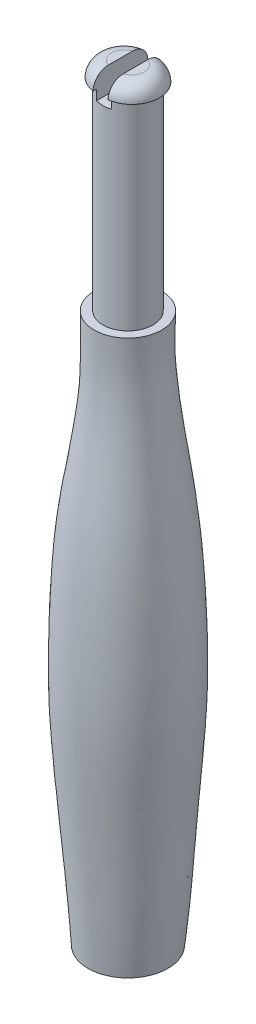
ISO-10303-21;
HEADER;
FILE_DESCRIPTION(('STEP AP214'),'2;1');
FILE_NAME('part.step','',(''),(''),'','','');
FILE_SCHEMA(('AUTOMOTIVE_DESIGN { 1 0 10303 214 1 1 1 1 }'));
ENDSEC;
DATA;
#1=APPLICATION_CONTEXT('core data for automotive mechanical design processes');
#2=APPLICATION_PROTOCOL_DEFINITION('international standard','automotive_design',2000,#1);
#3=PRODUCT_CONTEXT('',#1,'mechanical');
#4=PRODUCT('Part','Part','',(#3));
#5=PRODUCT_RELATED_PRODUCT_CATEGORY('part','',(#4));
#6=PRODUCT_DEFINITION_FORMATION('','',#4);
#7=PRODUCT_DEFINITION_CONTEXT('part definition',#1,'design');
#8=PRODUCT_DEFINITION('design','',#6,#7);
#9=PRODUCT_DEFINITION_SHAPE('','',#8);
#10=(LENGTH_UNIT() NAMED_UNIT(*) SI_UNIT(.MILLI.,.METRE.));
#11=(NAMED_UNIT(*) PLANE_ANGLE_UNIT() SI_UNIT($,.RADIAN.));
#12=(NAMED_UNIT(*) SI_UNIT($,.STERADIAN.) SOLID_ANGLE_UNIT());
#13=UNCERTAINTY_MEASURE_WITH_UNIT(LENGTH_MEASURE(1.E-05),#10,'distance_accuracy_value','');
#14=(GEOMETRIC_REPRESENTATION_CONTEXT(3) GLOBAL_UNCERTAINTY_ASSIGNED_CONTEXT((#13)) GLOBAL_UNIT_ASSIGNED_CONTEXT((#10,
#11,#12)) REPRESENTATION_CONTEXT('',''));
#15=CARTESIAN_POINT('',(0.,0.,0.));
#16=DIRECTION('',(0.,0.,1.));
#17=DIRECTION('',(1.,0.,0.));
#18=AXIS2_PLACEMENT_3D('',#15,#16,#17);
#19=CARTESIAN_POINT('',(-1.49848932062445E-13,150.,1.49848932062445E-13));
#20=DIRECTION('',(0.,-1.,0.));
#21=DIRECTION('',(0.,0.,-1.));
#22=AXIS2_PLACEMENT_3D('',#19,#20,#21);
#23=CYLINDRICAL_SURFACE('',#22,5.);
#24=DIRECTION('',(0.,1.,0.));
#25=VECTOR('',#24,1.);
#26=CARTESIAN_POINT('',(1.49999999999985,148.,-4.76969600708458));
#27=LINE('',#26,#25);
#28=CARTESIAN_POINT('',(1.49999999999985,148.,-4.76969600708458));
#29=VERTEX_POINT('',#28);
#30=CARTESIAN_POINT('',(1.49999999999985,150.,-4.76969600708458));
#31=VERTEX_POINT('',#30);
#32=EDGE_CURVE('E215',#29,#31,#27,.T.);
#33=ORIENTED_EDGE('',*,*,#32,.T.);
#34=CARTESIAN_POINT('',(-1.49848932062445E-13,150.,1.49848932062445E-13));
#35=DIRECTION('',(0.,-1.,0.));
#36=DIRECTION('',(0.,0.,-1.));
#37=AXIS2_PLACEMENT_3D('',#34,#35,#36);
#38=CIRCLE('',#37,5.);
#39=CARTESIAN_POINT('',(1.49999999999985,150.,4.76969600708488));
#40=VERTEX_POINT('',#39);
#41=EDGE_CURVE('E230',#31,#40,#38,.T.);
#42=ORIENTED_EDGE('',*,*,#41,.T.);
#43=DIRECTION('',(0.,1.,0.));
#44=VECTOR('',#43,1.);
#45=CARTESIAN_POINT('',(1.49999999999985,148.,4.76969600708488));
#46=LINE('',#45,#44);
#47=CARTESIAN_POINT('',(1.49999999999985,148.,4.76969600708488));
#48=VERTEX_POINT('',#47);
#49=EDGE_CURVE('E220',#48,#40,#46,.T.);
#50=ORIENTED_EDGE('',*,*,#49,.F.);
#51=CARTESIAN_POINT('',(-1.47850946301613E-13,148.,1.47850946301613E-13));
#52=DIRECTION('',(0.,1.,0.));
#53=DIRECTION('',(0.,0.,1.));
#54=AXIS2_PLACEMENT_3D('',#51,#52,#53);
#55=CIRCLE('',#54,5.);
#56=CARTESIAN_POINT('',(-1.50000000000015,148.,4.76969600708488));
#57=VERTEX_POINT('',#56);
#58=EDGE_CURVE('E207',#57,#48,#55,.T.);
#59=ORIENTED_EDGE('',*,*,#58,.F.);
#60=DIRECTION('',(0.,1.,0.));
#61=VECTOR('',#60,1.);
#62=CARTESIAN_POINT('',(-1.50000000000015,148.,4.76969600708488));
#63=LINE('',#62,#61);
#64=CARTESIAN_POINT('',(-1.50000000000015,150.,4.76969600708488));
#65=VERTEX_POINT('',#64);
#66=EDGE_CURVE('E224',#57,#65,#63,.T.);
#67=ORIENTED_EDGE('',*,*,#66,.T.);
#68=CARTESIAN_POINT('',(-1.50000000000015,150.,-4.76969600708458));
#69=VERTEX_POINT('',#68);
#70=EDGE_CURVE('E175',#65,#69,#38,.T.);
#71=ORIENTED_EDGE('',*,*,#70,.T.);
#72=DIRECTION('',(0.,1.,0.));
#73=VECTOR('',#72,1.);
#74=CARTESIAN_POINT('',(-1.50000000000015,148.,-4.76969600708458));
#75=LINE('',#74,#73);
#76=CARTESIAN_POINT('',(-1.50000000000015,148.,-4.76969600708458));
#77=VERTEX_POINT('',#76);
#78=EDGE_CURVE('E214',#77,#69,#75,.T.);
#79=ORIENTED_EDGE('',*,*,#78,.F.);
#80=CARTESIAN_POINT('',(-1.47850946301613E-13,148.,1.47850946301613E-13));
#81=DIRECTION('',(0.,1.,0.));
#82=DIRECTION('',(0.,0.,1.));
#83=AXIS2_PLACEMENT_3D('',#80,#81,#82);
#84=CIRCLE('',#83,5.);
#85=EDGE_CURVE('E191',#29,#77,#84,.T.);
#86=ORIENTED_EDGE('',*,*,#85,.F.);
#87=EDGE_LOOP('',(#33,#42,#50,#59,#67,#71,#79,#86));
#88=FACE_BOUND('',#87,.T.);
#89=CARTESIAN_POINT('',(-1.09889216845793E-13,110.,1.09889216845793E-13));
#90=DIRECTION('',(0.,-1.,0.));
#91=DIRECTION('',(0.,0.,-1.));
#92=AXIS2_PLACEMENT_3D('',#89,#90,#91);
#93=CIRCLE('',#92,5.);
#94=CARTESIAN_POINT('',(-1.09889216845793E-13,110.,-4.99999999999989));
#95=VERTEX_POINT('',#94);
#96=EDGE_CURVE('E219',#95,#95,#93,.T.);
#97=ORIENTED_EDGE('',*,*,#96,.F.);
#98=EDGE_LOOP('',(#97));
#99=FACE_BOUND('',#98,.T.);
#100=ADVANCED_FACE('F81',(#88,#99),#23,.T.);
#101=CARTESIAN_POINT('',(-1.09889216845793E-13,110.,1.09889216845793E-13));
#102=DIRECTION('',(0.,-1.,0.));
#103=DIRECTION('',(0.,0.,-1.));
#104=AXIS2_PLACEMENT_3D('',#101,#102,#103);
#105=PLANE('',#104);
#106=ORIENTED_EDGE('',*,*,#96,.T.);
#107=EDGE_LOOP('',(#106));
#108=FACE_BOUND('',#107,.T.);
#109=ADVANCED_FACE('F261',(#108),#105,.T.);
#110=CARTESIAN_POINT('',(1.49999999999985,148.,4.76969600708488));
#111=DIRECTION('',(1.,0.,0.));
#112=DIRECTION('',(0.,1.,0.));
#113=AXIS2_PLACEMENT_3D('',#110,#111,#112);
#114=PLANE('',#113);
#115=DIRECTION('',(0.,0.,1.));
#116=VECTOR('',#115,1.);
#117=CARTESIAN_POINT('',(1.49999999999985,153.,-5.47317321121836));
#118=LINE('',#117,#116);
#119=CARTESIAN_POINT('',(1.49999999999985,153.,-2.41523484882925));
#120=VERTEX_POINT('',#119);
#121=CARTESIAN_POINT('',(1.49999999999985,153.,2.41523484882956));
#122=VERTEX_POINT('',#121);
#123=EDGE_CURVE('E187',#120,#122,#118,.T.);
#124=ORIENTED_EDGE('',*,*,#123,.F.);
#125=CARTESIAN_POINT('',(1.49999999999985,153.,-2.41523484882925));
#126=CARTESIAN_POINT('',(1.49999999999985,153.000017058611,-2.50479520211446));
#127=CARTESIAN_POINT('',(1.49999999999985,152.996316458633,-2.59436427616199));
#128=CARTESIAN_POINT('',(1.49999999999985,152.981409998157,-2.77289406426873));
#129=CARTESIAN_POINT('',(1.49999999999985,152.970202467802,-2.86185463852326));
#130=CARTESIAN_POINT('',(1.49999999999985,152.940207753691,-3.03852699684103));
#131=CARTESIAN_POINT('',(1.49999999999985,152.921418356523,-3.12623840848187));
#132=CARTESIAN_POINT('',(1.49999999999985,152.876333018237,-3.29967501447033));
#133=CARTESIAN_POINT('',(1.49999999999985,152.850037870796,-3.38540041778788));
#134=CARTESIAN_POINT('',(1.49999999999985,152.760641529783,-3.63691735873574));
#135=CARTESIAN_POINT('',(1.49999999999985,152.686696072893,-3.79901163951167));
#136=CARTESIAN_POINT('',(1.49999999999985,152.511726114415,-4.10761259592768));
#137=CARTESIAN_POINT('',(1.49999999999985,152.410721819697,-4.25413078981842));
#138=CARTESIAN_POINT('',(1.49999999999985,152.18865125786,-4.52217640491635));
#139=CARTESIAN_POINT('',(1.49999999999985,152.068448736301,-4.64441918345205));
#140=CARTESIAN_POINT('',(1.49999999999985,151.808933187061,-4.86668575947977));
#141=CARTESIAN_POINT('',(1.49999999999985,151.669615011733,-4.96670355294529));
#142=CARTESIAN_POINT('',(1.49999999999985,151.377927438106,-5.14029074069879));
#143=CARTESIAN_POINT('',(1.49999999999985,151.225757576704,-5.21419606669464));
#144=CARTESIAN_POINT('',(1.49999999999985,150.911175526208,-5.33519013866772));
#145=CARTESIAN_POINT('',(1.49999999999985,150.748772227355,-5.38230181422073));
#146=CARTESIAN_POINT('',(1.49999999999985,150.487574636789,-5.43458106794303));
#147=CARTESIAN_POINT('',(1.49999999999985,150.390548319795,-5.44904905334437));
#148=CARTESIAN_POINT('',(1.49999999999985,150.195695970415,-5.46834023153826));
#149=CARTESIAN_POINT('',(1.49999999999985,150.097871437744,-5.47317857444688));
#150=CARTESIAN_POINT('',(1.49999999999985,150.,-5.47317321121837));
#151=B_SPLINE_CURVE_WITH_KNOTS('',3,(#125,#126,#127,#128,#129,#130,#131,#132,#133,#134,#135,
#136,#137,#138,#139,#140,#141,#142,#143,#144,#145,#146,#147,#148,#149,#150),.UNSPECIFIED.,.F.,
.F.,(4,2,2,2,2,2,2,2,2,2,2,2,4),(0.,0.268615320819069,0.537290412834672,0.806043997330498,
1.07476917365609,1.60632891703442,2.13749280596515,2.64932885674469,3.16130301116006,
3.66642786126774,4.17111978064965,4.46498494408795,4.75838740895957),.UNSPECIFIED.);
#152=CARTESIAN_POINT('',(1.49999999999985,150.,-5.47317321121837));
#153=VERTEX_POINT('',#152);
#154=EDGE_CURVE('E248',#120,#153,#151,.T.);
#155=ORIENTED_EDGE('',*,*,#154,.T.);
#156=DIRECTION('',(0.,0.,1.));
#157=VECTOR('',#156,1.);
#158=CARTESIAN_POINT('',(1.49999999999985,150.,-5.47317321121837));
#159=LINE('',#158,#157);
#160=EDGE_CURVE('E192',#153,#31,#159,.T.);
#161=ORIENTED_EDGE('',*,*,#160,.T.);
#162=ORIENTED_EDGE('',*,*,#32,.F.);
#163=DIRECTION('',(0.,0.,-1.));
#164=VECTOR('',#163,1.);
#165=CARTESIAN_POINT('',(1.49999999999985,148.,4.76969600708488));
#166=LINE('',#165,#164);
#167=EDGE_CURVE('E210',#48,#29,#166,.T.);
#168=ORIENTED_EDGE('',*,*,#167,.F.);
#169=ORIENTED_EDGE('',*,*,#49,.T.);
#170=CARTESIAN_POINT('',(1.49999999999985,150.,5.47317321121867));
#171=VERTEX_POINT('',#170);
#172=EDGE_CURVE('E197',#40,#171,#159,.T.);
#173=ORIENTED_EDGE('',*,*,#172,.T.);
#174=CARTESIAN_POINT('',(1.49999999999985,150.,5.47317321121867));
#175=CARTESIAN_POINT('',(1.49999999999985,150.083761351196,5.47318147565272));
#176=CARTESIAN_POINT('',(1.49999999999985,150.167518788211,5.46963501454631));
#177=CARTESIAN_POINT('',(1.49999999999985,150.33443232537,5.45549654399866));
#178=CARTESIAN_POINT('',(1.49999999999985,150.417588459091,5.44490493106639));
#179=CARTESIAN_POINT('',(1.49999999999985,150.582638764506,5.41675312459688));
#180=CARTESIAN_POINT('',(1.49999999999985,150.664534036465,5.39919941191866));
#181=CARTESIAN_POINT('',(1.49999999999985,150.826534297394,5.35726893413452));
#182=CARTESIAN_POINT('',(1.49999999999985,150.906639305679,5.33289224267447));
#183=CARTESIAN_POINT('',(1.49999999999985,151.143489984933,5.24973311676771));
#184=CARTESIAN_POINT('',(1.49999999999985,151.296845767303,5.18090885606034));
#185=CARTESIAN_POINT('',(1.49999999999985,151.589754696767,5.01858428831538));
#186=CARTESIAN_POINT('',(1.49999999999985,151.729309277256,4.92508654757825));
#187=CARTESIAN_POINT('',(1.49999999999985,151.991144644232,4.71586110385369));
#188=CARTESIAN_POINT('',(1.49999999999985,152.113387194987,4.60008548683813));
#189=CARTESIAN_POINT('',(1.49999999999985,152.336862413262,4.34978037553934));
#190=CARTESIAN_POINT('',(1.49999999999985,152.438093831183,4.2152497666333));
#191=CARTESIAN_POINT('',(1.49999999999985,152.617537853716,3.93025847617379));
#192=CARTESIAN_POINT('',(1.49999999999985,152.695575773745,3.77968796059336));
#193=CARTESIAN_POINT('',(1.49999999999985,152.825718711644,3.46771575454883));
#194=CARTESIAN_POINT('',(1.49999999999985,152.877825458911,3.30631478720243));
#195=CARTESIAN_POINT('',(1.49999999999985,152.944445726797,3.02278146434177));
#196=CARTESIAN_POINT('',(1.49999999999985,152.965365552378,2.90210505085879));
#197=CARTESIAN_POINT('',(1.49999999999985,152.993153863968,2.65936476095003));
#198=CARTESIAN_POINT('',(1.49999999999985,153.000048097548,2.53730384129184));
#199=CARTESIAN_POINT('',(1.49999999999985,153.,2.41523484882956));
#200=B_SPLINE_CURVE_WITH_KNOTS('',3,(#174,#175,#176,#177,#178,#179,#180,#181,#182,#183,#184,
#185,#186,#187,#188,#189,#190,#191,#192,#193,#194,#195,#196,#197,#198,#199),.UNSPECIFIED.,.F.,
.F.,(4,2,2,2,2,2,2,2,2,2,2,2,4),(0.,0.251201971966918,0.502389807203627,0.753344364185471,
1.00429621251878,1.50597612970048,2.0076038874659,2.51032282726639,3.01307165676584,
3.51951625490598,4.0259270727962,4.39257664856152,4.75855253540268),.UNSPECIFIED.);
#201=EDGE_CURVE('E240',#171,#122,#200,.T.);
#202=ORIENTED_EDGE('',*,*,#201,.T.);
#203=EDGE_LOOP('',(#124,#155,#161,#162,#168,#169,#173,#202));
#204=FACE_BOUND('',#203,.T.);
#205=ADVANCED_FACE('F257',(#204),#114,.F.);
#206=CARTESIAN_POINT('',(-1.50000000000015,148.,4.76969600708488));
#207=DIRECTION('',(-1.,0.,0.));
#208=DIRECTION('',(0.,-1.,0.));
#209=AXIS2_PLACEMENT_3D('',#206,#207,#208);
#210=PLANE('',#209);
#211=DIRECTION('',(0.,0.,-1.));
#212=VECTOR('',#211,1.);
#213=CARTESIAN_POINT('',(-1.50000000000015,153.,-5.47317321121836));
#214=LINE('',#213,#212);
#215=CARTESIAN_POINT('',(-1.50000000000015,153.,2.41523484882956));
#216=VERTEX_POINT('',#215);
#217=CARTESIAN_POINT('',(-1.50000000000015,153.,-2.41523484882925));
#218=VERTEX_POINT('',#217);
#219=EDGE_CURVE('E169',#216,#218,#214,.T.);
#220=ORIENTED_EDGE('',*,*,#219,.F.);
#221=CARTESIAN_POINT('',(-1.50000000000015,153.,2.41523484882956));
#222=CARTESIAN_POINT('',(-1.50000000000015,153.000017058611,2.50479520211476));
#223=CARTESIAN_POINT('',(-1.50000000000015,152.996316458633,2.59436427616229));
#224=CARTESIAN_POINT('',(-1.50000000000015,152.981409998157,2.77289406426903));
#225=CARTESIAN_POINT('',(-1.50000000000015,152.970202467802,2.86185463852356));
#226=CARTESIAN_POINT('',(-1.50000000000015,152.940207753691,3.03852699684133));
#227=CARTESIAN_POINT('',(-1.50000000000015,152.921418356523,3.12623840848217));
#228=CARTESIAN_POINT('',(-1.50000000000015,152.876333018237,3.29967501447063));
#229=CARTESIAN_POINT('',(-1.50000000000015,152.850037870796,3.38540041778817));
#230=CARTESIAN_POINT('',(-1.50000000000015,152.760641529783,3.63691735873604));
#231=CARTESIAN_POINT('',(-1.50000000000015,152.686696072893,3.79901163951197));
#232=CARTESIAN_POINT('',(-1.50000000000015,152.511726114415,4.10761259592798));
#233=CARTESIAN_POINT('',(-1.50000000000015,152.410721819697,4.25413078981872));
#234=CARTESIAN_POINT('',(-1.50000000000015,152.18865125786,4.52217640491665));
#235=CARTESIAN_POINT('',(-1.50000000000015,152.068448736301,4.64441918345235));
#236=CARTESIAN_POINT('',(-1.50000000000015,151.808933187061,4.86668575948007));
#237=CARTESIAN_POINT('',(-1.50000000000015,151.669615011733,4.96670355294558));
#238=CARTESIAN_POINT('',(-1.50000000000015,151.377927438106,5.14029074069909));
#239=CARTESIAN_POINT('',(-1.50000000000015,151.225757576704,5.21419606669494));
#240=CARTESIAN_POINT('',(-1.50000000000015,150.911175526208,5.33519013866802));
#241=CARTESIAN_POINT('',(-1.50000000000015,150.748772227355,5.38230181422103));
#242=CARTESIAN_POINT('',(-1.50000000000015,150.487574636789,5.43458106794333));
#243=CARTESIAN_POINT('',(-1.50000000000015,150.390548319795,5.44904905334467));
#244=CARTESIAN_POINT('',(-1.50000000000015,150.195695970415,5.46834023153856));
#245=CARTESIAN_POINT('',(-1.50000000000015,150.097871437744,5.47317857444718));
#246=CARTESIAN_POINT('',(-1.50000000000015,150.,5.47317321121867));
#247=B_SPLINE_CURVE_WITH_KNOTS('',3,(#221,#222,#223,#224,#225,#226,#227,#228,#229,#230,#231,
#232,#233,#234,#235,#236,#237,#238,#239,#240,#241,#242,#243,#244,#245,#246),.UNSPECIFIED.,.F.,
.F.,(4,2,2,2,2,2,2,2,2,2,2,2,4),(0.,0.268615320819065,0.537290412834666,0.80604399733049,
1.07476917365609,1.60632891703442,2.13749280596515,2.64932885674468,3.16130301116005,
3.66642786126773,4.17111978064964,4.46498494408794,4.75838740895956),.UNSPECIFIED.);
#248=CARTESIAN_POINT('',(-1.50000000000015,150.,5.47317321121867));
#249=VERTEX_POINT('',#248);
#250=EDGE_CURVE('E14',#216,#249,#247,.T.);
#251=ORIENTED_EDGE('',*,*,#250,.T.);
#252=DIRECTION('',(0.,0.,-1.));
#253=VECTOR('',#252,1.);
#254=CARTESIAN_POINT('',(-1.50000000000015,150.,-5.47317321121837));
#255=LINE('',#254,#253);
#256=EDGE_CURVE('E167',#249,#65,#255,.T.);
#257=ORIENTED_EDGE('',*,*,#256,.T.);
#258=ORIENTED_EDGE('',*,*,#66,.F.);
#259=DIRECTION('',(0.,0.,1.));
#260=VECTOR('',#259,1.);
#261=CARTESIAN_POINT('',(-1.50000000000015,148.,4.76969600708488));
#262=LINE('',#261,#260);
#263=EDGE_CURVE('E203',#77,#57,#262,.T.);
#264=ORIENTED_EDGE('',*,*,#263,.F.);
#265=ORIENTED_EDGE('',*,*,#78,.T.);
#266=CARTESIAN_POINT('',(-1.50000000000015,150.,-5.47317321121837));
#267=VERTEX_POINT('',#266);
#268=EDGE_CURVE('E178',#69,#267,#255,.T.);
#269=ORIENTED_EDGE('',*,*,#268,.T.);
#270=CARTESIAN_POINT('',(-1.50000000000015,150.,-5.47317321121837));
#271=CARTESIAN_POINT('',(-1.50000000000015,150.083761351196,-5.47318147565242));
#272=CARTESIAN_POINT('',(-1.50000000000015,150.167518788211,-5.46963501454601));
#273=CARTESIAN_POINT('',(-1.50000000000015,150.33443232537,-5.45549654399836));
#274=CARTESIAN_POINT('',(-1.50000000000015,150.417588459091,-5.44490493106609));
#275=CARTESIAN_POINT('',(-1.50000000000015,150.582638764506,-5.41675312459658));
#276=CARTESIAN_POINT('',(-1.50000000000015,150.664534036465,-5.39919941191836));
#277=CARTESIAN_POINT('',(-1.50000000000015,150.826534297394,-5.35726893413422));
#278=CARTESIAN_POINT('',(-1.50000000000015,150.906639305679,-5.33289224267417));
#279=CARTESIAN_POINT('',(-1.50000000000015,151.143489984933,-5.24973311676741));
#280=CARTESIAN_POINT('',(-1.50000000000015,151.296845767303,-5.18090885606004));
#281=CARTESIAN_POINT('',(-1.50000000000015,151.589754696767,-5.01858428831508));
#282=CARTESIAN_POINT('',(-1.50000000000015,151.729309277256,-4.92508654757796));
#283=CARTESIAN_POINT('',(-1.50000000000015,151.991144644232,-4.71586110385339));
#284=CARTESIAN_POINT('',(-1.50000000000015,152.113387194987,-4.60008548683783));
#285=CARTESIAN_POINT('',(-1.50000000000015,152.336862413262,-4.34978037553904));
#286=CARTESIAN_POINT('',(-1.50000000000015,152.438093831183,-4.215249766633));
#287=CARTESIAN_POINT('',(-1.50000000000015,152.617537853716,-3.93025847617349));
#288=CARTESIAN_POINT('',(-1.50000000000015,152.695575773745,-3.77968796059307));
#289=CARTESIAN_POINT('',(-1.50000000000015,152.825718711644,-3.46771575454854));
#290=CARTESIAN_POINT('',(-1.50000000000015,152.877825458911,-3.30631478720214));
#291=CARTESIAN_POINT('',(-1.50000000000015,152.944445726797,-3.02278146434147));
#292=CARTESIAN_POINT('',(-1.50000000000015,152.965365552378,-2.90210505085849));
#293=CARTESIAN_POINT('',(-1.50000000000015,152.993153863968,-2.65936476094973));
#294=CARTESIAN_POINT('',(-1.50000000000015,153.000048097548,-2.53730384129153));
#295=CARTESIAN_POINT('',(-1.50000000000015,153.,-2.41523484882925));
#296=B_SPLINE_CURVE_WITH_KNOTS('',3,(#270,#271,#272,#273,#274,#275,#276,#277,#278,#279,#280,
#281,#282,#283,#284,#285,#286,#287,#288,#289,#290,#291,#292,#293,#294,#295),.UNSPECIFIED.,.F.,
.F.,(4,2,2,2,2,2,2,2,2,2,2,2,4),(0.,0.251201971966918,0.502389807203627,0.753344364185471,
1.00429621251878,1.50597612970048,2.0076038874659,2.51032282726639,3.01307165676584,
3.51951625490598,4.0259270727962,4.39257664856152,4.7585525354027),.UNSPECIFIED.);
#297=EDGE_CURVE('E96',#267,#218,#296,.T.);
#298=ORIENTED_EDGE('',*,*,#297,.T.);
#299=EDGE_LOOP('',(#220,#251,#257,#258,#264,#265,#269,#298));
#300=FACE_BOUND('',#299,.T.);
#301=ADVANCED_FACE('F166',(#300),#210,.F.);
#302=CARTESIAN_POINT('',(-1.47850946301613E-13,148.,1.47850946301613E-13));
#303=DIRECTION('',(0.,1.,0.));
#304=DIRECTION('',(0.,0.,1.));
#305=AXIS2_PLACEMENT_3D('',#302,#303,#304);
#306=PLANE('',#305);
#307=ORIENTED_EDGE('',*,*,#85,.T.);
#308=ORIENTED_EDGE('',*,*,#263,.T.);
#309=ORIENTED_EDGE('',*,*,#58,.T.);
#310=ORIENTED_EDGE('',*,*,#167,.T.);
#311=EDGE_LOOP('',(#307,#308,#309,#310));
#312=FACE_BOUND('',#311,.T.);
#313=ADVANCED_FACE('F263',(#312),#306,.T.);
#314=CARTESIAN_POINT('',(0.779622395833181,153.,1.52845910703694E-13));
#315=DIRECTION('',(0.,-1.,0.));
#316=DIRECTION('',(0.,0.,-1.));
#317=AXIS2_PLACEMENT_3D('',#314,#315,#316);
#318=PLANE('',#317);
#319=ORIENTED_EDGE('',*,*,#123,.T.);
#320=CARTESIAN_POINT('',(0.779622395833181,153.,1.52845910703694E-13));
#321=DIRECTION('',(0.,-1.,0.));
#322=DIRECTION('',(0.,0.,-1.));
#323=AXIS2_PLACEMENT_3D('',#320,#321,#322);
#324=CIRCLE('',#323,2.52037760416667);
#325=EDGE_CURVE('E234',#122,#120,#324,.F.);
#326=ORIENTED_EDGE('',*,*,#325,.T.);
#327=EDGE_LOOP('',(#319,#326));
#328=FACE_BOUND('',#327,.T.);
#329=ADVANCED_FACE('F288',(#328),#318,.F.);
#330=CARTESIAN_POINT('',(0.779622395833184,150.,1.49848932062445E-13));
#331=DIRECTION('',(0.,-1.,0.));
#332=DIRECTION('',(0.,0.,-1.));
#333=AXIS2_PLACEMENT_3D('',#330,#331,#332);
#334=PLANE('',#333);
#335=ORIENTED_EDGE('',*,*,#172,.F.);
#336=ORIENTED_EDGE('',*,*,#41,.F.);
#337=ORIENTED_EDGE('',*,*,#160,.F.);
#338=CARTESIAN_POINT('',(0.779622395833184,150.,1.49848932062445E-13));
#339=DIRECTION('',(0.,1.,0.));
#340=DIRECTION('',(0.,0.,-1.));
#341=AXIS2_PLACEMENT_3D('',#338,#339,#340);
#342=CIRCLE('',#341,5.52037760416667);
#343=EDGE_CURVE('E193',#171,#153,#342,.T.);
#344=ORIENTED_EDGE('',*,*,#343,.F.);
#345=EDGE_LOOP('',(#335,#336,#337,#344));
#346=FACE_BOUND('',#345,.T.);
#347=ADVANCED_FACE('F285',(#346),#334,.T.);
#348=CARTESIAN_POINT('',(-0.779622395833487,153.,1.52845910703694E-13));
#349=DIRECTION('',(0.,1.,0.));
#350=DIRECTION('',(0.,0.,1.));
#351=AXIS2_PLACEMENT_3D('',#348,#349,#350);
#352=PLANE('',#351);
#353=ORIENTED_EDGE('',*,*,#219,.T.);
#354=CARTESIAN_POINT('',(-0.779622395833487,153.,1.52845910703694E-13));
#355=DIRECTION('',(0.,1.,0.));
#356=DIRECTION('',(0.,0.,1.));
#357=AXIS2_PLACEMENT_3D('',#354,#355,#356);
#358=CIRCLE('',#357,2.52037760416667);
#359=EDGE_CURVE('E274',#218,#216,#358,.T.);
#360=ORIENTED_EDGE('',*,*,#359,.T.);
#361=EDGE_LOOP('',(#353,#360));
#362=FACE_BOUND('',#361,.T.);
#363=ADVANCED_FACE('F295',(#362),#352,.T.);
#364=CARTESIAN_POINT('',(-0.779622395833484,150.,1.49848932062445E-13));
#365=DIRECTION('',(0.,1.,0.));
#366=DIRECTION('',(0.,0.,1.));
#367=AXIS2_PLACEMENT_3D('',#364,#365,#366);
#368=PLANE('',#367);
#369=ORIENTED_EDGE('',*,*,#70,.F.);
#370=ORIENTED_EDGE('',*,*,#256,.F.);
#371=CARTESIAN_POINT('',(-0.779622395833484,150.,1.49848932062445E-13));
#372=DIRECTION('',(0.,1.,0.));
#373=DIRECTION('',(0.,0.,1.));
#374=AXIS2_PLACEMENT_3D('',#371,#372,#373);
#375=CIRCLE('',#374,5.52037760416667);
#376=EDGE_CURVE('E173',#267,#249,#375,.T.);
#377=ORIENTED_EDGE('',*,*,#376,.F.);
#378=ORIENTED_EDGE('',*,*,#268,.F.);
#379=EDGE_LOOP('',(#369,#370,#377,#378));
#380=FACE_BOUND('',#379,.T.);
#381=ADVANCED_FACE('F172',(#380),#368,.F.);
#382=CARTESIAN_POINT('',(0.779622395833184,150.,1.49848932062445E-13));
#383=DIRECTION('',(0.,-1.,0.));
#384=DIRECTION('',(0.,0.,-1.));
#385=AXIS2_PLACEMENT_3D('',#382,#383,#384);
#386=DEGENERATE_TOROIDAL_SURFACE('',#385,2.52037760416667,3.,.T.);
#387=ORIENTED_EDGE('',*,*,#201,.F.);
#388=ORIENTED_EDGE('',*,*,#343,.T.);
#389=ORIENTED_EDGE('',*,*,#154,.F.);
#390=ORIENTED_EDGE('',*,*,#325,.F.);
#391=EDGE_LOOP('',(#387,#388,#389,#390));
#392=FACE_BOUND('',#391,.T.);
#393=ADVANCED_FACE('F254',(#392),#386,.T.);
#394=CARTESIAN_POINT('',(-0.779622395833484,150.,1.49848932062445E-13));
#395=DIRECTION('',(0.,1.,0.));
#396=DIRECTION('',(0.,0.,1.));
#397=AXIS2_PLACEMENT_3D('',#394,#395,#396);
#398=DEGENERATE_TOROIDAL_SURFACE('',#397,2.52037760416667,3.,.T.);
#399=ORIENTED_EDGE('',*,*,#297,.F.);
#400=ORIENTED_EDGE('',*,*,#376,.T.);
#401=ORIENTED_EDGE('',*,*,#250,.F.);
#402=ORIENTED_EDGE('',*,*,#359,.F.);
#403=EDGE_LOOP('',(#399,#400,#401,#402));
#404=FACE_BOUND('',#403,.T.);
#405=ADVANCED_FACE('F83',(#404),#398,.T.);
#406=CLOSED_SHELL('',(#100,#109,#205,#301,#313,#329,#347,#363,#381,#393,#405));
#407=MANIFOLD_SOLID_BREP('B2',#406);
#408=CARTESIAN_POINT('',(0.,0.,0.));
#409=DIRECTION('',(0.,1.,0.));
#410=DIRECTION('',(0.,0.,1.));
#411=AXIS2_PLACEMENT_3D('',#408,#409,#410);
#412=PLANE('',#411);
#413=CARTESIAN_POINT('',(-8.,0.,0.));
#414=CARTESIAN_POINT('',(-8.,0.,0.220766003969238));
#415=CARTESIAN_POINT('',(-7.98207660039693,0.,0.658144811113868));
#416=CARTESIAN_POINT('',(-7.90348683200447,0.,1.29968788962789));
#417=CARTESIAN_POINT('',(-7.77525792444555,0.,1.9246403061176));
#418=CARTESIAN_POINT('',(-6.72044282302159,0.,5.56241765398167));
#419=CARTESIAN_POINT('',(-3.53225606350784,0.,8.));
#420=CARTESIAN_POINT('',(4.4153200793848,0.,8.));
#421=CARTESIAN_POINT('',(8.,0.,4.4153200793848));
#422=CARTESIAN_POINT('',(8.,0.,-4.4153200793848));
#423=CARTESIAN_POINT('',(4.4153200793848,0.,-8.));
#424=CARTESIAN_POINT('',(-3.53225606350784,0.,-8.));
#425=CARTESIAN_POINT('',(-6.72044282302159,0.,-5.56241765398167));
#426=CARTESIAN_POINT('',(-7.77525792444555,0.,-1.9246403061176));
#427=CARTESIAN_POINT('',(-7.90348683200447,0.,-1.29968788962789));
#428=CARTESIAN_POINT('',(-7.98207660039693,0.,-0.658144811113873));
#429=CARTESIAN_POINT('',(-8.,0.,-0.220766003969241));
#430=CARTESIAN_POINT('',(-8.,0.,0.));
#431=B_SPLINE_CURVE_WITH_KNOTS('',3,(#413,#414,#415,#416,#417,#418,#419,#420,#421,#422,#423,
#424,#425,#426,#427,#428,#429,#430),.UNSPECIFIED.,.T.,.F.,(4,1,1,1,1,2,2,2,1,1,1,1,4),(0.,
0.0125,0.0249999999999999,0.0375000000000001,0.05,0.25,0.5,0.75,0.95,0.9625,0.975,0.9875,1.),.UNSPECIFIED.);
#432=CARTESIAN_POINT('',(-8.,0.,0.));
#433=VERTEX_POINT('',#432);
#434=EDGE_CURVE('E80',#433,#433,#431,.T.);
#435=ORIENTED_EDGE('',*,*,#434,.T.);
#436=EDGE_LOOP('',(#435));
#437=FACE_BOUND('',#436,.T.);
#438=ADVANCED_FACE('F398',(#437),#412,.T.);
#439=OPEN_SHELL('',(#438));
#440=SHELL_BASED_SURFACE_MODEL('B8',(#439));
#441=CARTESIAN_POINT('',(-1.09889216845793E-13,110.,1.09889216845793E-13));
#442=DIRECTION('',(0.,-1.,0.));
#443=DIRECTION('',(0.,0.,-1.));
#444=AXIS2_PLACEMENT_3D('',#441,#442,#443);
#445=PLANE('',#444);
#446=CARTESIAN_POINT('',(-6.75,110.,0.));
#447=CARTESIAN_POINT('',(-6.75,110.,-0.186271315849048));
#448=CARTESIAN_POINT('',(-6.7348771315849,110.,-0.555309684377332));
#449=CARTESIAN_POINT('',(-6.66856701450377,110.,-1.09661165687354));
#450=CARTESIAN_POINT('',(-6.56037387375093,110.,-1.62391525828673));
#451=CARTESIAN_POINT('',(-5.67037363192447,110.,-4.69328989554703));
#452=CARTESIAN_POINT('',(-2.98034105358474,110.,-6.75));
#453=CARTESIAN_POINT('',(3.72542631698093,110.,-6.75));
#454=CARTESIAN_POINT('',(6.75,110.,-3.72542631698092));
#455=CARTESIAN_POINT('',(6.75,110.,3.72542631698093));
#456=CARTESIAN_POINT('',(3.72542631698092,110.,6.75));
#457=CARTESIAN_POINT('',(-2.98034105358474,110.,6.75));
#458=CARTESIAN_POINT('',(-5.67037363192447,110.,4.69328989554703));
#459=CARTESIAN_POINT('',(-6.56037387375093,110.,1.62391525828672));
#460=CARTESIAN_POINT('',(-6.66856701450377,110.,1.09661165687353));
#461=CARTESIAN_POINT('',(-6.7348771315849,110.,0.555309684377326));
#462=CARTESIAN_POINT('',(-6.75,110.,0.186271315849044));
#463=CARTESIAN_POINT('',(-6.75,110.,0.));
#464=B_SPLINE_CURVE_WITH_KNOTS('',3,(#446,#447,#448,#449,#450,#451,#452,#453,#454,#455,#456,
#457,#458,#459,#460,#461,#462,#463),.UNSPECIFIED.,.T.,.F.,(4,1,1,1,1,2,2,2,1,1,1,1,4),(0.,
0.0125,0.025,0.0375,0.05,0.25,0.5,0.75,0.95,0.9625,0.975,0.9875,1.),.UNSPECIFIED.);
#465=CARTESIAN_POINT('',(-6.75,110.,0.));
#466=VERTEX_POINT('',#465);
#467=EDGE_CURVE('E397',#466,#466,#464,.F.);
#468=ORIENTED_EDGE('',*,*,#467,.F.);
#469=EDGE_LOOP('',(#468));
#470=FACE_BOUND('',#469,.T.);
#471=ADVANCED_FACE('F426',(#470),#445,.T.);
#472=OPEN_SHELL('',(#471));
#473=SHELL_BASED_SURFACE_MODEL('B75',(#472));
#474=CARTESIAN_POINT('',(-8.,0.,0.));
#475=CARTESIAN_POINT('',(-8.37206555418568,8.33593722884347,0.));
#476=CARTESIAN_POINT('',(-9.94670931195439,23.3193188624202,0.));
#477=CARTESIAN_POINT('',(-11.4115973823736,41.9826405273363,0.));
#478=CARTESIAN_POINT('',(-11.1753291023505,59.0166103648279,0.));
#479=CARTESIAN_POINT('',(-10.3069209754905,77.7601847160483,0.));
#480=CARTESIAN_POINT('',(-6.75000000000001,92.6030351214532,0.));
#481=CARTESIAN_POINT('',(-6.75,104.,0.));
#482=CARTESIAN_POINT('',(-6.75,107.,0.));
#483=CARTESIAN_POINT('',(-6.75,110.,0.));
#484=CARTESIAN_POINT('',(-8.,0.,0.220766003969238));
#485=CARTESIAN_POINT('',(-8.37206555418568,8.33593722884347,0.240833090753226));
#486=CARTESIAN_POINT('',(-9.94670931195439,23.3193188624202,0.270873491249657));
#487=CARTESIAN_POINT('',(-11.4115973823736,41.9826405273363,0.315193126190168));
#488=CARTESIAN_POINT('',(-11.1753291023505,59.0166103648279,0.308629852427363));
#489=CARTESIAN_POINT('',(-10.3069209754905,77.7601847160483,0.281069769856281));
#490=CARTESIAN_POINT('',(-6.75000000000001,92.6030351214532,0.195443388273837));
#491=CARTESIAN_POINT('',(-6.75,104.,0.182994391666035));
#492=CARTESIAN_POINT('',(-6.75,107.,0.18463285375754));
#493=CARTESIAN_POINT('',(-6.75,110.,0.186271315849044));
#494=CARTESIAN_POINT('',(-7.98207660039693,0.,0.658144811113868));
#495=CARTESIAN_POINT('',(-8.35250200324624,8.33593683210918,0.71834607146583));
#496=CARTESIAN_POINT('',(-9.92472194141255,23.3193190116347,0.807382630427539));
#497=CARTESIAN_POINT('',(-11.3860072028071,41.982640509407,0.939666811061794));
#498=CARTESIAN_POINT('',(-11.1502724664882,59.0166103718471,0.920076722610177));
#499=CARTESIAN_POINT('',(-10.2841015905482,77.7601847129939,0.83792453957665));
#500=CARTESIAN_POINT('',(-6.73413246746834,92.6030351211577,0.582653631568833));
#501=CARTESIAN_POINT('',(-6.73514317918449,104.000000000106,0.545540459096395));
#502=CARTESIAN_POINT('',(-6.7350101553847,107.000000000053,0.550425071736861));
#503=CARTESIAN_POINT('',(-6.7348771315849,110.,0.555309684377326));
#504=CARTESIAN_POINT('',(-7.90348683200447,0.,1.29968788962789));
#505=CARTESIAN_POINT('',(-8.26673882008347,8.33593600079239,1.41845487939002));
#506=CARTESIAN_POINT('',(-9.82830577962753,23.3193193242986,1.59444298375658));
#507=CARTESIAN_POINT('',(-11.2738012850758,41.9826404718379,1.85562519905804));
#508=CARTESIAN_POINT('',(-11.0404048609825,59.0166103865551,1.81694653747253));
#509=CARTESIAN_POINT('',(-10.1840442521726,77.7601847065938,1.65471149439377));
#510=CARTESIAN_POINT('',(-6.6645571920986,92.6030351205384,1.15060971183769));
#511=CARTESIAN_POINT('',(-6.66999961156587,104.000000000327,1.07731966658469));
#512=CARTESIAN_POINT('',(-6.66928331303482,107.000000000163,1.08696566172911));
#513=CARTESIAN_POINT('',(-6.66856701450377,110.,1.09661165687353));
#514=CARTESIAN_POINT('',(-7.77525792444555,0.,1.9246403061176));
#515=CARTESIAN_POINT('',(-8.12675685783165,8.33593541203887,2.100550111541));
#516=CARTESIAN_POINT('',(-9.67100924352095,23.3193195457329,2.36111505494539));
#517=CARTESIAN_POINT('',(-11.0907212777819,41.9826404452309,2.74790053289409));
#518=CARTESIAN_POINT('',(-10.861143163897,59.0166103969716,2.69062117728856));
#519=CARTESIAN_POINT('',(-10.0207879791559,77.7601847020611,2.45037658818121));
#520=CARTESIAN_POINT('',(-6.55103650626763,92.6030351200998,1.70387819917502));
#521=CARTESIAN_POINT('',(-6.5637098532215,104.000000000483,1.59534674262245));
#522=CARTESIAN_POINT('',(-6.56204186348622,107.000000000242,1.60963100045459));
#523=CARTESIAN_POINT('',(-6.56037387375093,110.,1.62391525828672));
#524=CARTESIAN_POINT('',(-6.72044282302159,0.,5.56241765398167));
#525=CARTESIAN_POINT('',(-6.97629417730745,8.33593557610166,6.07056148679274));
#526=CARTESIAN_POINT('',(-8.37669422010406,23.3193194840277,6.82397235705923));
#527=CARTESIAN_POINT('',(-9.58474597556472,41.9826404526452,7.94171682682656));
#528=CARTESIAN_POINT('',(-9.3865124171709,59.0166103940689,7.7761893239132));
#529=CARTESIAN_POINT('',(-8.67784460349913,77.7601847033242,7.08185014079584));
#530=CARTESIAN_POINT('',(-5.61721247774222,92.6030351202221,4.92439121243906));
#531=CARTESIAN_POINT('',(-5.68936662104062,104.00000000044,4.61072387786032));
#532=CARTESIAN_POINT('',(-5.67987012648254,107.00000000022,4.65200688670367));
#533=CARTESIAN_POINT('',(-5.67037363192447,110.,4.69328989554703));
#534=CARTESIAN_POINT('',(-3.53225606350784,0.,8.));
#535=CARTESIAN_POINT('',(-3.46875377917051,8.33593678957654,8.73881198341636));
#536=CARTESIAN_POINT('',(-4.4759973813937,23.3193190276315,9.81139349175981));
#537=CARTESIAN_POINT('',(-5.03155660725743,41.9826405074849,11.4223250508743));
#538=CARTESIAN_POINT('',(-4.92996497912204,59.0166103725996,11.1837572047774));
#539=CARTESIAN_POINT('',(-4.6185549673523,77.7601847126665,10.1853450620794));
#540=CARTESIAN_POINT('',(-2.79469962813768,92.603035121126,7.08238130350879));
#541=CARTESIAN_POINT('',(-3.04666552729603,104.000000000117,6.63124948419458));
#542=CARTESIAN_POINT('',(-3.01350329044039,107.000000000058,6.69062474209729));
#543=CARTESIAN_POINT('',(-2.98034105358474,110.,6.75));
#544=CARTESIAN_POINT('',(4.4153200793848,0.,8.));
#545=CARTESIAN_POINT('',(5.14387133363444,8.33593777792712,8.72156162731864));
#546=CARTESIAN_POINT('',(5.29702410891748,23.319318655906,9.81788146937299));
#547=CARTESIAN_POINT('',(6.31280343113345,41.9826405521506,11.4215454688093));
#548=CARTESIAN_POINT('',(6.18172465514442,59.0166103551133,11.1840624055588));
#549=CARTESIAN_POINT('',(5.49951509699503,77.7601847202756,10.1852122550589));
#550=CARTESIAN_POINT('',(4.24121961853652,92.6030351218622,7.08236845397846));
#551=CARTESIAN_POINT('',(3.54114783933457,103.999999999854,6.63125407497131));
#552=CARTESIAN_POINT('',(3.63328707815775,106.999999999927,6.69062703748566));
#553=CARTESIAN_POINT('',(3.72542631698092,110.,6.75));
#554=CARTESIAN_POINT('',(8.,0.,4.4153200793848));
#555=CARTESIAN_POINT('',(9.0902247627824,8.33593722884347,4.77610089304412));
#556=CARTESIAN_POINT('',(9.68184476277693,23.3193188624202,5.43272506682978));
#557=CARTESIAN_POINT('',(11.4323597575395,41.9826405273363,6.30202948527557));
#558=CARTESIAN_POINT('',(11.1924565967877,59.0166103648279,6.17331466997065));
#559=CARTESIAN_POINT('',(10.0636510979835,77.7601847160483,5.62108312674869));
#560=CARTESIAN_POINT('',(7.41475118521283,92.6030351214532,3.90883755225711));
#561=CARTESIAN_POINT('',(6.51250304907958,104.,3.65989862765655));
#562=CARTESIAN_POINT('',(6.63125152453979,107.,3.69266247231874));
#563=CARTESIAN_POINT('',(6.75,110.,3.72542631698093));
#564=CARTESIAN_POINT('',(8.,0.,-4.4153200793848));
#565=CARTESIAN_POINT('',(9.0902247627824,8.33593722884346,-4.77610089304411));
#566=CARTESIAN_POINT('',(9.68184476277693,23.3193188624202,-5.43272506682977));
#567=CARTESIAN_POINT('',(11.4323597575395,41.9826405273363,-6.30202948527556));
#568=CARTESIAN_POINT('',(11.1924565967877,59.0166103648279,-6.17331466997064));
#569=CARTESIAN_POINT('',(10.0636510979835,77.7601847160483,-5.62108312674868));
#570=CARTESIAN_POINT('',(7.41475118521283,92.6030351214532,-3.9088375522571));
#571=CARTESIAN_POINT('',(6.51250304907959,104.,-3.65989862765654));
#572=CARTESIAN_POINT('',(6.63125152453979,107.,-3.69266247231873));
#573=CARTESIAN_POINT('',(6.75,110.,-3.72542631698092));
#574=CARTESIAN_POINT('',(4.4153200793848,0.,-8.));
#575=CARTESIAN_POINT('',(5.14387133363445,8.33593777792712,-8.72156162731863));
#576=CARTESIAN_POINT('',(5.29702410891749,23.319318655906,-9.81788146937298));
#577=CARTESIAN_POINT('',(6.31280343113346,41.9826405521506,-11.4215454688093));
#578=CARTESIAN_POINT('',(6.18172465514443,59.0166103551133,-11.1840624055588));
#579=CARTESIAN_POINT('',(5.49951509699503,77.7601847202756,-10.1852122550589));
#580=CARTESIAN_POINT('',(4.24121961853652,92.6030351218622,-7.08236845397845));
#581=CARTESIAN_POINT('',(3.54114783933458,103.999999999854,-6.63125407497131));
#582=CARTESIAN_POINT('',(3.63328707815775,106.999999999927,-6.69062703748565));
#583=CARTESIAN_POINT('',(3.72542631698093,110.,-6.75));
#584=CARTESIAN_POINT('',(-3.53225606350784,0.,-8.));
#585=CARTESIAN_POINT('',(-3.4687537791705,8.33593678957654,-8.73881198341637));
#586=CARTESIAN_POINT('',(-4.4759973813937,23.3193190276315,-9.8113934917598));
#587=CARTESIAN_POINT('',(-5.03155660725742,41.9826405074849,-11.4223250508743));
#588=CARTESIAN_POINT('',(-4.92996497912204,59.0166103725996,-11.1837572047773));
#589=CARTESIAN_POINT('',(-4.6185549673523,77.7601847126665,-10.1853450620794));
#590=CARTESIAN_POINT('',(-2.79469962813767,92.603035121126,-7.08238130350879));
#591=CARTESIAN_POINT('',(-3.04666552729603,104.000000000117,-6.63124948419458));
#592=CARTESIAN_POINT('',(-3.01350329044038,107.000000000058,-6.69062474209729));
#593=CARTESIAN_POINT('',(-2.98034105358474,110.,-6.75));
#594=CARTESIAN_POINT('',(-6.72044282302159,0.,-5.56241765398167));
#595=CARTESIAN_POINT('',(-6.97629417730746,8.33593557610166,-6.07056148679276));
#596=CARTESIAN_POINT('',(-8.37669422010405,23.3193194840277,-6.82397235705922));
#597=CARTESIAN_POINT('',(-9.58474597556471,41.9826404526452,-7.94171682682655));
#598=CARTESIAN_POINT('',(-9.38651241717089,59.0166103940689,-7.77618932391319));
#599=CARTESIAN_POINT('',(-8.67784460349913,77.7601847033242,-7.08185014079584));
#600=CARTESIAN_POINT('',(-5.61721247774222,92.6030351202221,-4.92439121243905));
#601=CARTESIAN_POINT('',(-5.68936662104062,104.00000000044,-4.61072387786031));
#602=CARTESIAN_POINT('',(-5.67987012648254,107.00000000022,-4.65200688670367));
#603=CARTESIAN_POINT('',(-5.67037363192447,110.,-4.69328989554703));
#604=CARTESIAN_POINT('',(-7.77525792444555,0.,-1.9246403061176));
#605=CARTESIAN_POINT('',(-8.12675685783164,8.33593541203888,-2.100550111541));
#606=CARTESIAN_POINT('',(-9.67100924352094,23.3193195457329,-2.36111505494539));
#607=CARTESIAN_POINT('',(-11.0907212777819,41.9826404452309,-2.74790053289409));
#608=CARTESIAN_POINT('',(-10.861143163897,59.0166103969716,-2.69062117728856));
#609=CARTESIAN_POINT('',(-10.0207879791559,77.7601847020611,-2.45037658818121));
#610=CARTESIAN_POINT('',(-6.55103650626763,92.6030351200999,-1.70387819917502));
#611=CARTESIAN_POINT('',(-6.5637098532215,104.000000000483,-1.59534674262245));
#612=CARTESIAN_POINT('',(-6.56204186348622,107.000000000242,-1.60963100045459));
#613=CARTESIAN_POINT('',(-6.56037387375093,110.,-1.62391525828673));
#614=CARTESIAN_POINT('',(-7.90348683200447,0.,-1.29968788962789));
#615=CARTESIAN_POINT('',(-8.26673882008347,8.33593600079239,-1.41845487939002));
#616=CARTESIAN_POINT('',(-9.82830577962752,23.3193193242986,-1.59444298375658));
#617=CARTESIAN_POINT('',(-11.2738012850758,41.9826404718379,-1.85562519905804));
#618=CARTESIAN_POINT('',(-11.0404048609825,59.0166103865551,-1.81694653747253));
#619=CARTESIAN_POINT('',(-10.1840442521726,77.7601847065938,-1.65471149439377));
#620=CARTESIAN_POINT('',(-6.6645571920986,92.6030351205384,-1.15060971183769));
#621=CARTESIAN_POINT('',(-6.66999961156586,104.000000000327,-1.07731966658469));
#622=CARTESIAN_POINT('',(-6.66928331303482,107.000000000163,-1.08696566172911));
#623=CARTESIAN_POINT('',(-6.66856701450377,110.,-1.09661165687354));
#624=CARTESIAN_POINT('',(-7.98207660039693,0.,-0.658144811113873));
#625=CARTESIAN_POINT('',(-8.35250200324624,8.33593683210918,-0.718346071465832));
#626=CARTESIAN_POINT('',(-9.92472194141255,23.3193190116347,-0.807382630427542));
#627=CARTESIAN_POINT('',(-11.3860072028071,41.982640509407,-0.939666811061796));
#628=CARTESIAN_POINT('',(-11.1502724664882,59.0166103718471,-0.920076722610179));
#629=CARTESIAN_POINT('',(-10.2841015905482,77.7601847129939,-0.837924539576652));
#630=CARTESIAN_POINT('',(-6.73413246746834,92.6030351211577,-0.582653631568835));
#631=CARTESIAN_POINT('',(-6.73514317918448,104.000000000106,-0.545540459096397));
#632=CARTESIAN_POINT('',(-6.7350101553847,107.000000000053,-0.550425071736863));
#633=CARTESIAN_POINT('',(-6.7348771315849,110.,-0.555309684377332));
#634=CARTESIAN_POINT('',(-8.,0.,-0.220766003969241));
#635=CARTESIAN_POINT('',(-8.37206555418568,8.33593722884347,-0.240833090753226));
#636=CARTESIAN_POINT('',(-9.94670931195439,23.3193188624202,-0.270873491249657));
#637=CARTESIAN_POINT('',(-11.4115973823736,41.9826405273363,-0.315193126190168));
#638=CARTESIAN_POINT('',(-11.1753291023505,59.0166103648279,-0.308629852427363));
#639=CARTESIAN_POINT('',(-10.3069209754905,77.7601847160483,-0.281069769856281));
#640=CARTESIAN_POINT('',(-6.75000000000001,92.6030351214532,-0.195443388273837));
#641=CARTESIAN_POINT('',(-6.75,104.,-0.182994391666035));
#642=CARTESIAN_POINT('',(-6.75,107.,-0.18463285375754));
#643=CARTESIAN_POINT('',(-6.75,110.,-0.186271315849048));
#644=CARTESIAN_POINT('',(-8.,0.,0.));
#645=CARTESIAN_POINT('',(-8.37206555418568,8.33593722884347,0.));
#646=CARTESIAN_POINT('',(-9.94670931195439,23.3193188624202,0.));
#647=CARTESIAN_POINT('',(-11.4115973823736,41.9826405273363,0.));
#648=CARTESIAN_POINT('',(-11.1753291023505,59.0166103648279,0.));
#649=CARTESIAN_POINT('',(-10.3069209754905,77.7601847160483,0.));
#650=CARTESIAN_POINT('',(-6.75000000000001,92.6030351214532,0.));
#651=CARTESIAN_POINT('',(-6.75,104.,0.));
#652=CARTESIAN_POINT('',(-6.75,107.,0.));
#653=CARTESIAN_POINT('',(-6.75,110.,0.));
#654=B_SPLINE_SURFACE_WITH_KNOTS('',3,3,((#474,#475,#476,#477,#478,#479,#480,#481,#482,#483),
(#484,#485,#486,#487,#488,#489,#490,#491,#492,#493),(#494,#495,#496,#497,#498,#499,#500,#501,
#502,#503),(#504,#505,#506,#507,#508,#509,#510,#511,#512,#513),(#514,#515,#516,#517,#518,#519,
#520,#521,#522,#523),(#524,#525,#526,#527,#528,#529,#530,#531,#532,#533),(#534,#535,#536,#537,
#538,#539,#540,#541,#542,#543),(#544,#545,#546,#547,#548,#549,#550,#551,#552,#553),(#554,#555,
#556,#557,#558,#559,#560,#561,#562,#563),(#564,#565,#566,#567,#568,#569,#570,#571,#572,#573),
(#574,#575,#576,#577,#578,#579,#580,#581,#582,#583),(#584,#585,#586,#587,#588,#589,#590,#591,
#592,#593),(#594,#595,#596,#597,#598,#599,#600,#601,#602,#603),(#604,#605,#606,#607,#608,#609,
#610,#611,#612,#613),(#614,#615,#616,#617,#618,#619,#620,#621,#622,#623),(#624,#625,#626,#627,
#628,#629,#630,#631,#632,#633),(#634,#635,#636,#637,#638,#639,#640,#641,#642,#643),(#644,#645,
#646,#647,#648,#649,#650,#651,#652,#653)),.UNSPECIFIED.,.T.,.F.,.F.,(4,1,1,1,1,2,2,2,1,1,1,1,4),
(4,1,1,1,1,2,4),(0.,0.0125,0.0249999999999999,0.0375000000000001,0.05,0.25,0.5,0.75,0.95,0.9625,
0.975,0.9875,1.),(0.,0.227271209632632,0.408862776263386,0.508545955417275,0.690196300155523,
0.918450999065228,1.),.UNSPECIFIED.);
#655=CARTESIAN_POINT('',(-8.,0.,0.));
#656=CARTESIAN_POINT('',(-8.,0.,0.220766003969238));
#657=CARTESIAN_POINT('',(-7.98207660039693,0.,0.658144811113868));
#658=CARTESIAN_POINT('',(-7.90348683200447,0.,1.29968788962789));
#659=CARTESIAN_POINT('',(-7.77525792444555,0.,1.9246403061176));
#660=CARTESIAN_POINT('',(-6.72044282302159,0.,5.56241765398167));
#661=CARTESIAN_POINT('',(-3.53225606350784,0.,8.));
#662=CARTESIAN_POINT('',(4.4153200793848,0.,8.));
#663=CARTESIAN_POINT('',(8.,0.,4.4153200793848));
#664=CARTESIAN_POINT('',(8.,0.,-4.4153200793848));
#665=CARTESIAN_POINT('',(4.4153200793848,0.,-8.));
#666=CARTESIAN_POINT('',(-3.53225606350784,0.,-8.));
#667=CARTESIAN_POINT('',(-6.72044282302159,0.,-5.56241765398167));
#668=CARTESIAN_POINT('',(-7.77525792444555,0.,-1.9246403061176));
#669=CARTESIAN_POINT('',(-7.90348683200447,0.,-1.29968788962789));
#670=CARTESIAN_POINT('',(-7.98207660039693,0.,-0.658144811113873));
#671=CARTESIAN_POINT('',(-8.,0.,-0.220766003969241));
#672=CARTESIAN_POINT('',(-8.,0.,0.));
#673=B_SPLINE_CURVE_WITH_KNOTS('',3,(#655,#656,#657,#658,#659,#660,#661,#662,#663,#664,#665,
#666,#667,#668,#669,#670,#671,#672),.UNSPECIFIED.,.T.,.F.,(4,1,1,1,1,2,2,2,1,1,1,1,4),(0.,
0.0125,0.0249999999999999,0.0375000000000001,0.05,0.25,0.5,0.75,0.95,0.9625,0.975,0.9875,1.),.UNSPECIFIED.);
#674=CARTESIAN_POINT('',(-8.,0.,0.));
#675=VERTEX_POINT('',#674);
#676=EDGE_CURVE('E425',#675,#675,#673,.T.);
#677=CARTESIAN_POINT('',(-6.75,110.,0.));
#678=CARTESIAN_POINT('',(-6.75,110.,0.186271315849044));
#679=CARTESIAN_POINT('',(-6.7348771315849,110.,0.555309684377326));
#680=CARTESIAN_POINT('',(-6.66856701450377,110.,1.09661165687353));
#681=CARTESIAN_POINT('',(-6.56037387375093,110.,1.62391525828672));
#682=CARTESIAN_POINT('',(-5.67037363192447,110.,4.69328989554703));
#683=CARTESIAN_POINT('',(-2.98034105358474,110.,6.75));
#684=CARTESIAN_POINT('',(3.72542631698092,110.,6.75));
#685=CARTESIAN_POINT('',(6.75,110.,3.72542631698093));
#686=CARTESIAN_POINT('',(6.75,110.,-3.72542631698092));
#687=CARTESIAN_POINT('',(3.72542631698093,110.,-6.75));
#688=CARTESIAN_POINT('',(-2.98034105358474,110.,-6.75));
#689=CARTESIAN_POINT('',(-5.67037363192447,110.,-4.69328989554703));
#690=CARTESIAN_POINT('',(-6.56037387375093,110.,-1.62391525828673));
#691=CARTESIAN_POINT('',(-6.66856701450377,110.,-1.09661165687354));
#692=CARTESIAN_POINT('',(-6.7348771315849,110.,-0.555309684377332));
#693=CARTESIAN_POINT('',(-6.75,110.,-0.186271315849048));
#694=CARTESIAN_POINT('',(-6.75,110.,0.));
#695=B_SPLINE_CURVE_WITH_KNOTS('',3,(#677,#678,#679,#680,#681,#682,#683,#684,#685,#686,#687,
#688,#689,#690,#691,#692,#693,#694),.UNSPECIFIED.,.T.,.F.,(4,1,1,1,1,2,2,2,1,1,1,1,4),(0.,
0.0125,0.0249999999999999,0.0375000000000001,0.05,0.25,0.5,0.75,0.95,0.9625,0.975,0.9875,1.),.UNSPECIFIED.);
#696=CARTESIAN_POINT('',(-6.75,110.,0.));
#697=VERTEX_POINT('',#696);
#698=EDGE_CURVE('E450',#697,#697,#695,.F.);
#699=ORIENTED_EDGE('',*,*,#676,.T.);
#700=EDGE_LOOP('',(#699));
#701=FACE_BOUND('',#700,.T.);
#702=ORIENTED_EDGE('',*,*,#698,.T.);
#703=EDGE_LOOP('',(#702));
#704=FACE_BOUND('',#703,.T.);
#705=ADVANCED_FACE('F447',(#701,#704),#654,.T.);
#706=OPEN_SHELL('',(#705));
#707=SHELL_BASED_SURFACE_MODEL('B392',(#706));
#708=ADVANCED_BREP_SHAPE_REPRESENTATION('',(#18,#407),#14);
#709=MANIFOLD_SURFACE_SHAPE_REPRESENTATION('',(#18,#440,#473,#707),#14);
#710=SHAPE_REPRESENTATION('',(#18),#14);
#711=SHAPE_DEFINITION_REPRESENTATION(#9,#710);
#712=SHAPE_REPRESENTATION_RELATIONSHIP('','',#710,#708);
#713=SHAPE_REPRESENTATION_RELATIONSHIP('','',#710,#709);
ENDSEC;
END-ISO-10303-21;
